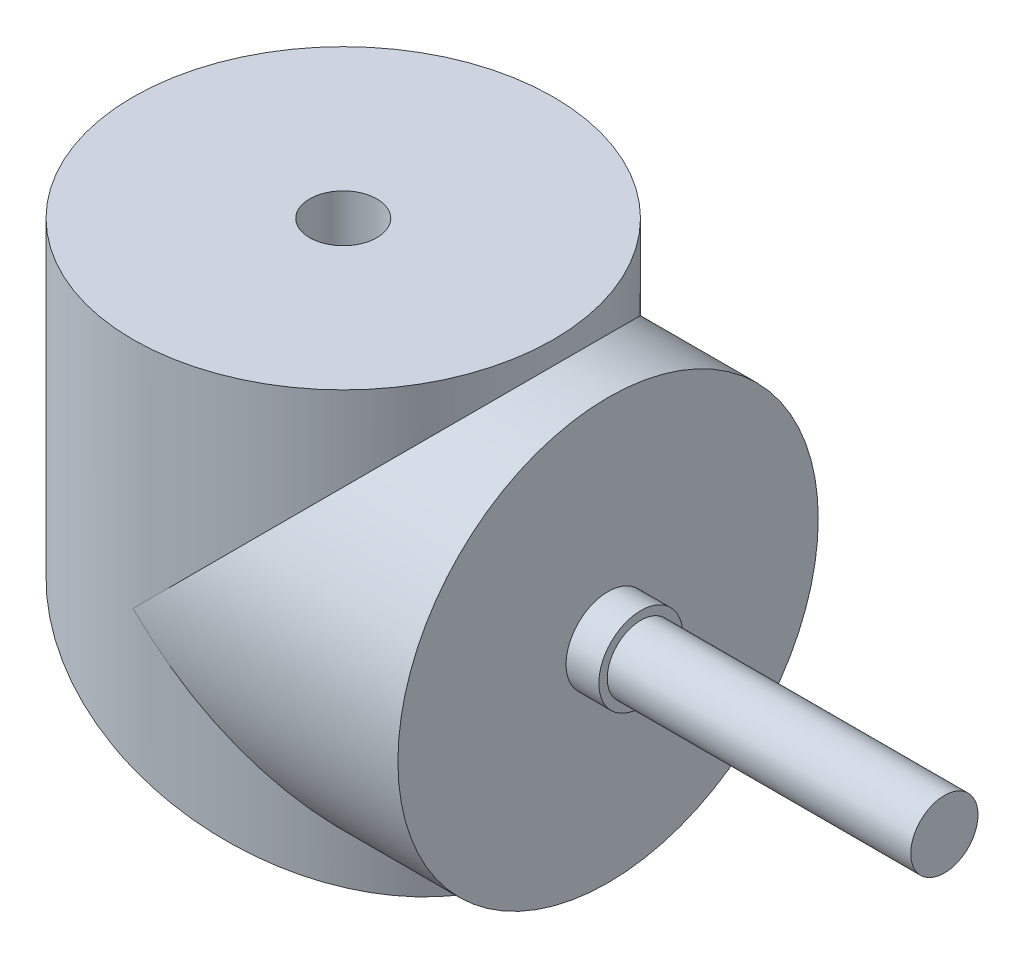
ISO-10303-21;
HEADER;
FILE_DESCRIPTION(('STEP AP214'),'2;1');
FILE_NAME('part.step','',(''),(''),'','','');
FILE_SCHEMA(('AUTOMOTIVE_DESIGN { 1 0 10303 214 1 1 1 1 }'));
ENDSEC;
DATA;
#1=APPLICATION_CONTEXT('core data for automotive mechanical design processes');
#2=APPLICATION_PROTOCOL_DEFINITION('international standard','automotive_design',2000,#1);
#3=PRODUCT_CONTEXT('',#1,'mechanical');
#4=PRODUCT('Part','Part','',(#3));
#5=PRODUCT_RELATED_PRODUCT_CATEGORY('part','',(#4));
#6=PRODUCT_DEFINITION_FORMATION('','',#4);
#7=PRODUCT_DEFINITION_CONTEXT('part definition',#1,'design');
#8=PRODUCT_DEFINITION('design','',#6,#7);
#9=PRODUCT_DEFINITION_SHAPE('','',#8);
#10=(LENGTH_UNIT() NAMED_UNIT(*) SI_UNIT(.MILLI.,.METRE.));
#11=(NAMED_UNIT(*) PLANE_ANGLE_UNIT() SI_UNIT($,.RADIAN.));
#12=(NAMED_UNIT(*) SI_UNIT($,.STERADIAN.) SOLID_ANGLE_UNIT());
#13=UNCERTAINTY_MEASURE_WITH_UNIT(LENGTH_MEASURE(1.E-05),#10,'distance_accuracy_value','');
#14=(GEOMETRIC_REPRESENTATION_CONTEXT(3) GLOBAL_UNCERTAINTY_ASSIGNED_CONTEXT((#13)) GLOBAL_UNIT_ASSIGNED_CONTEXT((#10,
#11,#12)) REPRESENTATION_CONTEXT('',''));
#15=CARTESIAN_POINT('',(0.,0.,0.));
#16=DIRECTION('',(0.,0.,1.));
#17=DIRECTION('',(1.,0.,0.));
#18=AXIS2_PLACEMENT_3D('',#15,#16,#17);
#19=CARTESIAN_POINT('',(0.,-39.70459341,0.));
#20=DIRECTION('',(0.,1.,0.));
#21=DIRECTION('',(0.,0.,1.));
#22=AXIS2_PLACEMENT_3D('',#19,#20,#21);
#23=CYLINDRICAL_SURFACE('',#22,37.5);
#24=CARTESIAN_POINT('',(0.,-24.7045790352276,0.));
#25=DIRECTION('',(0.371390983173378,0.928476568157491,0.));
#26=DIRECTION('',(-0.928476568157491,0.371390983173378,0.));
#27=AXIS2_PLACEMENT_3D('',#24,#25,#26);
#28=ELLIPSE('',#27,40.3887413921674,37.5);
#29=CARTESIAN_POINT('',(-37.5,-9.70456466045524,0.));
#30=VERTEX_POINT('',#29);
#31=EDGE_CURVE('E73',#30,#30,#28,.F.);
#32=ORIENTED_EDGE('',*,*,#31,.F.);
#33=EDGE_LOOP('',(#32));
#34=FACE_BOUND('',#33,.T.);
#35=CARTESIAN_POINT('',(0.,41.55,0.));
#36=DIRECTION('',(0.,1.,0.));
#37=DIRECTION('',(0.,0.,1.));
#38=AXIS2_PLACEMENT_3D('',#35,#36,#37);
#39=CIRCLE('',#38,37.5);
#40=CARTESIAN_POINT('',(0.,41.55,37.5));
#41=VERTEX_POINT('',#40);
#42=EDGE_CURVE('E65',#41,#41,#39,.T.);
#43=ORIENTED_EDGE('',*,*,#42,.F.);
#44=EDGE_LOOP('',(#43));
#45=FACE_BOUND('',#44,.T.);
#46=CARTESIAN_POINT('',(0.,0.,0.));
#47=DIRECTION('',(-0.707106781186547,0.707106781186547,0.));
#48=DIRECTION('',(-0.707106781186547,-0.707106781186547,0.));
#49=AXIS2_PLACEMENT_3D('',#46,#47,#48);
#50=ELLIPSE('',#49,53.0330085889911,37.5);
#51=CARTESIAN_POINT('',(0.,0.,-37.5));
#52=VERTEX_POINT('',#51);
#53=CARTESIAN_POINT('',(0.,0.,37.5));
#54=VERTEX_POINT('',#53);
#55=EDGE_CURVE('E55',#52,#54,#50,.F.);
#56=ORIENTED_EDGE('',*,*,#55,.F.);
#57=CARTESIAN_POINT('',(0.,0.,0.));
#58=DIRECTION('',(-0.707106781186547,-0.707106781186547,0.));
#59=DIRECTION('',(-0.707106781186547,0.707106781186547,0.));
#60=AXIS2_PLACEMENT_3D('',#57,#58,#59);
#61=ELLIPSE('',#60,53.0330085889911,37.5);
#62=EDGE_CURVE('E62',#54,#52,#61,.F.);
#63=ORIENTED_EDGE('',*,*,#62,.F.);
#64=EDGE_LOOP('',(#56,#63));
#65=FACE_BOUND('',#64,.T.);
#66=ADVANCED_FACE('F45',(#34,#45,#65),#23,.T.);
#67=CARTESIAN_POINT('',(0.,41.55,0.));
#68=DIRECTION('',(0.,1.,0.));
#69=DIRECTION('',(0.,0.,1.));
#70=AXIS2_PLACEMENT_3D('',#67,#68,#69);
#71=PLANE('',#70);
#72=CARTESIAN_POINT('',(0.,41.55,0.));
#73=DIRECTION('',(0.,1.,0.));
#74=DIRECTION('',(0.,0.,1.));
#75=AXIS2_PLACEMENT_3D('',#72,#73,#74);
#76=CIRCLE('',#75,6.);
#77=CARTESIAN_POINT('',(0.,41.55,6.));
#78=VERTEX_POINT('',#77);
#79=EDGE_CURVE('E90',#78,#78,#76,.T.);
#80=ORIENTED_EDGE('',*,*,#79,.F.);
#81=EDGE_LOOP('',(#80));
#82=FACE_BOUND('',#81,.T.);
#83=ORIENTED_EDGE('',*,*,#42,.T.);
#84=EDGE_LOOP('',(#83));
#85=FACE_BOUND('',#84,.T.);
#86=ADVANCED_FACE('F107',(#82,#85),#71,.T.);
#87=CARTESIAN_POINT('',(47.25,0.,0.));
#88=DIRECTION('',(-1.,0.,0.));
#89=DIRECTION('',(0.,0.,1.));
#90=AXIS2_PLACEMENT_3D('',#87,#88,#89);
#91=CYLINDRICAL_SURFACE('',#90,37.5);
#92=CARTESIAN_POINT('',(47.25,0.,0.));
#93=DIRECTION('',(1.,0.,0.));
#94=DIRECTION('',(0.,0.,-1.));
#95=AXIS2_PLACEMENT_3D('',#92,#93,#94);
#96=CIRCLE('',#95,37.5);
#97=CARTESIAN_POINT('',(47.25,0.,-37.5));
#98=VERTEX_POINT('',#97);
#99=EDGE_CURVE('E11',#98,#98,#96,.T.);
#100=ORIENTED_EDGE('',*,*,#99,.F.);
#101=EDGE_LOOP('',(#100));
#102=FACE_BOUND('',#101,.T.);
#103=ORIENTED_EDGE('',*,*,#62,.T.);
#104=ORIENTED_EDGE('',*,*,#55,.T.);
#105=EDGE_LOOP('',(#103,#104));
#106=FACE_BOUND('',#105,.T.);
#107=ADVANCED_FACE('F47',(#102,#106),#91,.T.);
#108=CARTESIAN_POINT('',(47.25,0.,0.));
#109=DIRECTION('',(1.,0.,0.));
#110=DIRECTION('',(0.,0.,-1.));
#111=AXIS2_PLACEMENT_3D('',#108,#109,#110);
#112=PLANE('',#111);
#113=CARTESIAN_POINT('',(47.25,0.,0.));
#114=DIRECTION('',(1.,0.,0.));
#115=DIRECTION('',(0.,0.,-1.));
#116=AXIS2_PLACEMENT_3D('',#113,#114,#115);
#117=CIRCLE('',#116,7.5);
#118=CARTESIAN_POINT('',(47.25,0.,-7.5));
#119=VERTEX_POINT('',#118);
#120=EDGE_CURVE('E81',#119,#119,#117,.T.);
#121=ORIENTED_EDGE('',*,*,#120,.F.);
#122=EDGE_LOOP('',(#121));
#123=FACE_BOUND('',#122,.T.);
#124=ORIENTED_EDGE('',*,*,#99,.T.);
#125=EDGE_LOOP('',(#124));
#126=FACE_BOUND('',#125,.T.);
#127=ADVANCED_FACE('F122',(#123,#126),#112,.T.);
#128=CARTESIAN_POINT('',(-37.5,-9.70456466045523,-37.5));
#129=DIRECTION('',(0.371390983173378,0.928476568157491,0.));
#130=DIRECTION('',(-0.928476568157491,0.371390983173378,0.));
#131=AXIS2_PLACEMENT_3D('',#128,#129,#130);
#132=PLANE('',#131);
#133=ORIENTED_EDGE('',*,*,#31,.T.);
#134=EDGE_LOOP('',(#133));
#135=FACE_BOUND('',#134,.T.);
#136=ADVANCED_FACE('F124',(#135),#132,.F.);
#137=CARTESIAN_POINT('',(53.1,0.,0.));
#138=DIRECTION('',(-1.,0.,0.));
#139=DIRECTION('',(0.,0.,1.));
#140=AXIS2_PLACEMENT_3D('',#137,#138,#139);
#141=CYLINDRICAL_SURFACE('',#140,7.5);
#142=CARTESIAN_POINT('',(53.1,0.,0.));
#143=DIRECTION('',(1.,0.,0.));
#144=DIRECTION('',(0.,0.,-1.));
#145=AXIS2_PLACEMENT_3D('',#142,#143,#144);
#146=CIRCLE('',#145,7.5);
#147=CARTESIAN_POINT('',(53.1,0.,-7.5));
#148=VERTEX_POINT('',#147);
#149=EDGE_CURVE('E85',#148,#148,#146,.T.);
#150=ORIENTED_EDGE('',*,*,#149,.F.);
#151=EDGE_LOOP('',(#150));
#152=FACE_BOUND('',#151,.T.);
#153=ORIENTED_EDGE('',*,*,#120,.T.);
#154=EDGE_LOOP('',(#153));
#155=FACE_BOUND('',#154,.T.);
#156=ADVANCED_FACE('F130',(#152,#155),#141,.T.);
#157=CARTESIAN_POINT('',(53.1,0.,0.));
#158=DIRECTION('',(1.,0.,0.));
#159=DIRECTION('',(0.,0.,-1.));
#160=AXIS2_PLACEMENT_3D('',#157,#158,#159);
#161=PLANE('',#160);
#162=CARTESIAN_POINT('',(53.1,0.,0.));
#163=DIRECTION('',(1.,0.,0.));
#164=DIRECTION('',(0.,0.,-1.));
#165=AXIS2_PLACEMENT_3D('',#162,#163,#164);
#166=CIRCLE('',#165,6.);
#167=CARTESIAN_POINT('',(53.1,0.,-6.));
#168=VERTEX_POINT('',#167);
#169=EDGE_CURVE('E49',#168,#168,#166,.T.);
#170=ORIENTED_EDGE('',*,*,#169,.F.);
#171=EDGE_LOOP('',(#170));
#172=FACE_BOUND('',#171,.T.);
#173=ORIENTED_EDGE('',*,*,#149,.T.);
#174=EDGE_LOOP('',(#173));
#175=FACE_BOUND('',#174,.T.);
#176=ADVANCED_FACE('F137',(#172,#175),#161,.T.);
#177=CARTESIAN_POINT('',(107.25,0.,0.));
#178=DIRECTION('',(1.,0.,0.));
#179=DIRECTION('',(0.,0.,-1.));
#180=AXIS2_PLACEMENT_3D('',#177,#178,#179);
#181=PLANE('',#180);
#182=CARTESIAN_POINT('',(107.25,0.,0.));
#183=DIRECTION('',(1.,0.,0.));
#184=DIRECTION('',(0.,0.,-1.));
#185=AXIS2_PLACEMENT_3D('',#182,#183,#184);
#186=CIRCLE('',#185,6.);
#187=CARTESIAN_POINT('',(107.25,0.,-6.));
#188=VERTEX_POINT('',#187);
#189=EDGE_CURVE('E77',#188,#188,#186,.T.);
#190=ORIENTED_EDGE('',*,*,#189,.T.);
#191=EDGE_LOOP('',(#190));
#192=FACE_BOUND('',#191,.T.);
#193=ADVANCED_FACE('F143',(#192),#181,.T.);
#194=CARTESIAN_POINT('',(107.25,0.,0.));
#195=DIRECTION('',(-1.,0.,0.));
#196=DIRECTION('',(0.,0.,1.));
#197=AXIS2_PLACEMENT_3D('',#194,#195,#196);
#198=CYLINDRICAL_SURFACE('',#197,6.);
#199=ORIENTED_EDGE('',*,*,#169,.T.);
#200=EDGE_LOOP('',(#199));
#201=FACE_BOUND('',#200,.T.);
#202=ORIENTED_EDGE('',*,*,#189,.F.);
#203=EDGE_LOOP('',(#202));
#204=FACE_BOUND('',#203,.T.);
#205=ADVANCED_FACE('F103',(#201,#204),#198,.T.);
#206=CARTESIAN_POINT('',(0.,-16.6,0.));
#207=DIRECTION('',(0.,1.,0.));
#208=DIRECTION('',(0.,0.,1.));
#209=AXIS2_PLACEMENT_3D('',#206,#207,#208);
#210=CYLINDRICAL_SURFACE('',#209,6.);
#211=CARTESIAN_POINT('',(0.,-16.6,0.));
#212=DIRECTION('',(0.,1.,0.));
#213=DIRECTION('',(0.,0.,1.));
#214=AXIS2_PLACEMENT_3D('',#211,#212,#213);
#215=CIRCLE('',#214,6.);
#216=CARTESIAN_POINT('',(0.,-16.6,6.));
#217=VERTEX_POINT('',#216);
#218=EDGE_CURVE('E86',#217,#217,#215,.T.);
#219=ORIENTED_EDGE('',*,*,#218,.F.);
#220=EDGE_LOOP('',(#219));
#221=FACE_BOUND('',#220,.T.);
#222=ORIENTED_EDGE('',*,*,#79,.T.);
#223=EDGE_LOOP('',(#222));
#224=FACE_BOUND('',#223,.T.);
#225=ADVANCED_FACE('F100',(#221,#224),#210,.F.);
#226=CARTESIAN_POINT('',(0.,-16.6,0.));
#227=DIRECTION('',(0.,1.,0.));
#228=DIRECTION('',(0.,0.,1.));
#229=AXIS2_PLACEMENT_3D('',#226,#227,#228);
#230=PLANE('',#229);
#231=ORIENTED_EDGE('',*,*,#218,.T.);
#232=EDGE_LOOP('',(#231));
#233=FACE_BOUND('',#232,.T.);
#234=ADVANCED_FACE('F98',(#233),#230,.T.);
#235=CLOSED_SHELL('',(#66,#86,#107,#127,#136,#156,#176,#193,#205,#225,#234));
#236=MANIFOLD_SOLID_BREP('B2',#235);
#237=ADVANCED_BREP_SHAPE_REPRESENTATION('',(#18,#236),#14);
#238=SHAPE_DEFINITION_REPRESENTATION(#9,#237);
ENDSEC;
END-ISO-10303-21;
